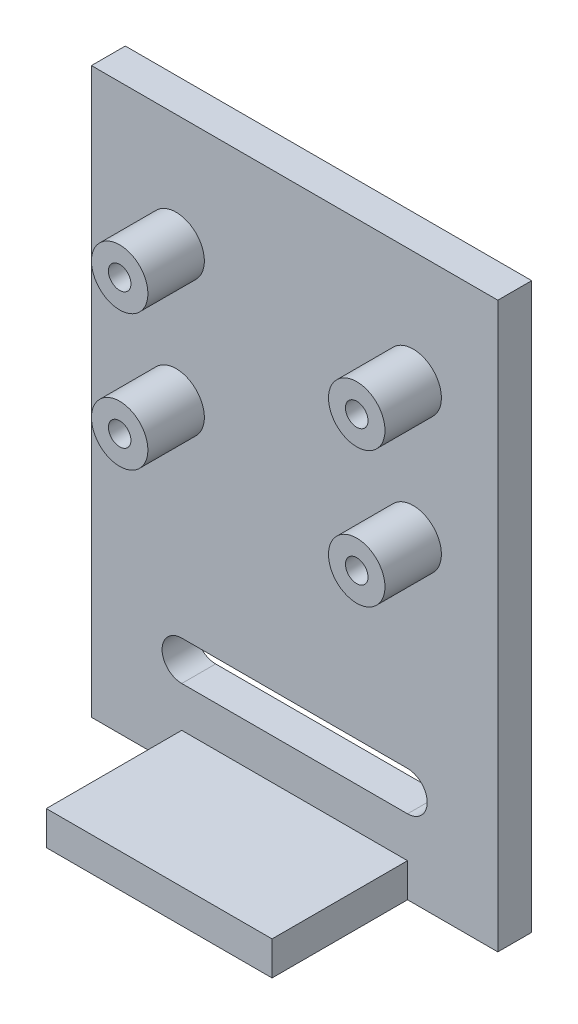
ISO-10303-21;
HEADER;
FILE_DESCRIPTION(('STEP AP214'),'2;1');
FILE_NAME('part.step','',(''),(''),'','','');
FILE_SCHEMA(('AUTOMOTIVE_DESIGN { 1 0 10303 214 1 1 1 1 }'));
ENDSEC;
DATA;
#1=APPLICATION_CONTEXT('core data for automotive mechanical design processes');
#2=APPLICATION_PROTOCOL_DEFINITION('international standard','automotive_design',2000,#1);
#3=PRODUCT_CONTEXT('',#1,'mechanical');
#4=PRODUCT('Part','Part','',(#3));
#5=PRODUCT_RELATED_PRODUCT_CATEGORY('part','',(#4));
#6=PRODUCT_DEFINITION_FORMATION('','',#4);
#7=PRODUCT_DEFINITION_CONTEXT('part definition',#1,'design');
#8=PRODUCT_DEFINITION('design','',#6,#7);
#9=PRODUCT_DEFINITION_SHAPE('','',#8);
#10=(LENGTH_UNIT() NAMED_UNIT(*) SI_UNIT(.MILLI.,.METRE.));
#11=(NAMED_UNIT(*) PLANE_ANGLE_UNIT() SI_UNIT($,.RADIAN.));
#12=(NAMED_UNIT(*) SI_UNIT($,.STERADIAN.) SOLID_ANGLE_UNIT());
#13=UNCERTAINTY_MEASURE_WITH_UNIT(LENGTH_MEASURE(1.E-05),#10,'distance_accuracy_value','');
#14=(GEOMETRIC_REPRESENTATION_CONTEXT(3) GLOBAL_UNCERTAINTY_ASSIGNED_CONTEXT((#13)) GLOBAL_UNIT_ASSIGNED_CONTEXT((#10,
#11,#12)) REPRESENTATION_CONTEXT('',''));
#15=CARTESIAN_POINT('',(0.,0.,0.));
#16=DIRECTION('',(0.,0.,1.));
#17=DIRECTION('',(1.,0.,0.));
#18=AXIS2_PLACEMENT_3D('',#15,#16,#17);
#19=CARTESIAN_POINT('',(0.,0.,3.));
#20=DIRECTION('',(0.,0.,-1.));
#21=DIRECTION('',(-1.,0.,0.));
#22=AXIS2_PLACEMENT_3D('',#19,#20,#21);
#23=PLANE('',#22);
#24=CARTESIAN_POINT('',(4.13294797687863,-2.05780346820808,3.));
#25=DIRECTION('',(0.,0.,-1.));
#26=DIRECTION('',(-1.,0.,0.));
#27=AXIS2_PLACEMENT_3D('',#24,#25,#26);
#28=CIRCLE('',#27,2.5);
#29=CARTESIAN_POINT('',(1.63294797687863,-2.05780346820808,3.));
#30=VERTEX_POINT('',#29);
#31=EDGE_CURVE('E11',#30,#30,#28,.F.);
#32=ORIENTED_EDGE('',*,*,#31,.F.);
#33=EDGE_LOOP('',(#32));
#34=FACE_BOUND('',#33,.T.);
#35=CARTESIAN_POINT('',(-16.8670520231214,-2.05780346820808,3.));
#36=DIRECTION('',(0.,0.,-1.));
#37=DIRECTION('',(-1.,0.,0.));
#38=AXIS2_PLACEMENT_3D('',#35,#36,#37);
#39=CIRCLE('',#38,2.5);
#40=CARTESIAN_POINT('',(-19.3670520231214,-2.05780346820808,3.));
#41=VERTEX_POINT('',#40);
#42=EDGE_CURVE('E42',#41,#41,#39,.F.);
#43=ORIENTED_EDGE('',*,*,#42,.F.);
#44=EDGE_LOOP('',(#43));
#45=FACE_BOUND('',#44,.T.);
#46=CARTESIAN_POINT('',(-16.8670520231214,9.94219653179192,3.));
#47=DIRECTION('',(0.,0.,-1.));
#48=DIRECTION('',(-1.,0.,0.));
#49=AXIS2_PLACEMENT_3D('',#46,#47,#48);
#50=CIRCLE('',#49,2.5);
#51=CARTESIAN_POINT('',(-19.3670520231214,9.94219653179192,3.));
#52=VERTEX_POINT('',#51);
#53=EDGE_CURVE('E221',#52,#52,#50,.F.);
#54=ORIENTED_EDGE('',*,*,#53,.F.);
#55=EDGE_LOOP('',(#54));
#56=FACE_BOUND('',#55,.T.);
#57=CARTESIAN_POINT('',(4.13294797687862,9.94219653179191,3.));
#58=DIRECTION('',(0.,0.,-1.));
#59=DIRECTION('',(-1.,0.,0.));
#60=AXIS2_PLACEMENT_3D('',#57,#58,#59);
#61=CIRCLE('',#60,2.5);
#62=CARTESIAN_POINT('',(1.63294797687862,9.94219653179191,3.));
#63=VERTEX_POINT('',#62);
#64=EDGE_CURVE('E218',#63,#63,#61,.F.);
#65=ORIENTED_EDGE('',*,*,#64,.F.);
#66=EDGE_LOOP('',(#65));
#67=FACE_BOUND('',#66,.T.);
#68=DIRECTION('',(1.,0.,0.));
#69=VECTOR('',#68,1.);
#70=CARTESIAN_POINT('',(-16.3670520231214,-23.4622845592564,3.));
#71=LINE('',#70,#69);
#72=CARTESIAN_POINT('',(-16.3670520231214,-23.4622845592564,3.));
#73=VERTEX_POINT('',#72);
#74=CARTESIAN_POINT('',(3.63294797687863,-23.4622845592564,3.));
#75=VERTEX_POINT('',#74);
#76=EDGE_CURVE('E135',#73,#75,#71,.T.);
#77=ORIENTED_EDGE('',*,*,#76,.F.);
#78=CARTESIAN_POINT('',(-16.3670520231214,-21.7213201317248,3.));
#79=DIRECTION('',(0.,0.,1.));
#80=DIRECTION('',(1.,0.,0.));
#81=AXIS2_PLACEMENT_3D('',#78,#79,#80);
#82=CIRCLE('',#81,1.74096442753159);
#83=CARTESIAN_POINT('',(-16.3670520231214,-19.9803557041932,3.));
#84=VERTEX_POINT('',#83);
#85=EDGE_CURVE('E49',#84,#73,#82,.T.);
#86=ORIENTED_EDGE('',*,*,#85,.F.);
#87=DIRECTION('',(-1.,0.,0.));
#88=VECTOR('',#87,1.);
#89=CARTESIAN_POINT('',(-16.3670520231214,-19.9803557041932,3.));
#90=LINE('',#89,#88);
#91=CARTESIAN_POINT('',(3.63294797687863,-19.9803557041932,3.));
#92=VERTEX_POINT('',#91);
#93=EDGE_CURVE('E141',#92,#84,#90,.T.);
#94=ORIENTED_EDGE('',*,*,#93,.F.);
#95=CARTESIAN_POINT('',(3.63294797687863,-21.7213201317248,3.));
#96=DIRECTION('',(0.,0.,1.));
#97=DIRECTION('',(1.,0.,0.));
#98=AXIS2_PLACEMENT_3D('',#95,#96,#97);
#99=CIRCLE('',#98,1.74096442753159);
#100=EDGE_CURVE('E126',#75,#92,#99,.T.);
#101=ORIENTED_EDGE('',*,*,#100,.F.);
#102=EDGE_LOOP('',(#77,#86,#94,#101));
#103=FACE_BOUND('',#102,.T.);
#104=DIRECTION('',(0.,-1.,0.));
#105=VECTOR('',#104,1.);
#106=CARTESIAN_POINT('',(-16.3670520231214,-27.0578034682081,3.));
#107=LINE('',#106,#105);
#108=CARTESIAN_POINT('',(-16.3670520231214,-27.0578034682081,3.));
#109=VERTEX_POINT('',#108);
#110=CARTESIAN_POINT('',(-16.3670520231214,-30.0578034682081,3.));
#111=VERTEX_POINT('',#110);
#112=EDGE_CURVE('E155',#109,#111,#107,.T.);
#113=ORIENTED_EDGE('',*,*,#112,.F.);
#114=DIRECTION('',(-1.,0.,0.));
#115=VECTOR('',#114,1.);
#116=CARTESIAN_POINT('',(3.63294797687862,-27.0578034682081,3.));
#117=LINE('',#116,#115);
#118=CARTESIAN_POINT('',(3.63294797687862,-27.0578034682081,3.));
#119=VERTEX_POINT('',#118);
#120=EDGE_CURVE('E164',#119,#109,#117,.T.);
#121=ORIENTED_EDGE('',*,*,#120,.F.);
#122=DIRECTION('',(0.,1.,0.));
#123=VECTOR('',#122,1.);
#124=CARTESIAN_POINT('',(3.63294797687862,-30.0578034682081,3.));
#125=LINE('',#124,#123);
#126=CARTESIAN_POINT('',(3.63294797687862,-30.0578034682081,3.));
#127=VERTEX_POINT('',#126);
#128=EDGE_CURVE('E148',#127,#119,#125,.T.);
#129=ORIENTED_EDGE('',*,*,#128,.F.);
#130=DIRECTION('',(1.,0.,0.));
#131=VECTOR('',#130,1.);
#132=CARTESIAN_POINT('',(11.6329479768786,-30.0578034682081,3.));
#133=LINE('',#132,#131);
#134=CARTESIAN_POINT('',(11.6329479768786,-30.0578034682081,3.));
#135=VERTEX_POINT('',#134);
#136=EDGE_CURVE('E189',#127,#135,#133,.T.);
#137=ORIENTED_EDGE('',*,*,#136,.T.);
#138=DIRECTION('',(0.,1.,0.));
#139=VECTOR('',#138,1.);
#140=CARTESIAN_POINT('',(11.6329479768786,19.9421965317919,3.));
#141=LINE('',#140,#139);
#142=CARTESIAN_POINT('',(11.6329479768786,19.9421965317919,3.));
#143=VERTEX_POINT('',#142);
#144=EDGE_CURVE('E181',#135,#143,#141,.T.);
#145=ORIENTED_EDGE('',*,*,#144,.T.);
#146=DIRECTION('',(-1.,0.,0.));
#147=VECTOR('',#146,1.);
#148=CARTESIAN_POINT('',(11.6329479768786,19.9421965317919,3.));
#149=LINE('',#148,#147);
#150=CARTESIAN_POINT('',(-24.3670520231214,19.9421965317919,3.));
#151=VERTEX_POINT('',#150);
#152=EDGE_CURVE('E184',#143,#151,#149,.T.);
#153=ORIENTED_EDGE('',*,*,#152,.T.);
#154=DIRECTION('',(0.,-1.,0.));
#155=VECTOR('',#154,1.);
#156=CARTESIAN_POINT('',(-24.3670520231214,19.9421965317919,3.));
#157=LINE('',#156,#155);
#158=CARTESIAN_POINT('',(-24.3670520231214,-30.0578034682081,3.));
#159=VERTEX_POINT('',#158);
#160=EDGE_CURVE('E187',#151,#159,#157,.T.);
#161=ORIENTED_EDGE('',*,*,#160,.T.);
#162=EDGE_CURVE('E190',#159,#111,#133,.T.);
#163=ORIENTED_EDGE('',*,*,#162,.T.);
#164=EDGE_LOOP('',(#113,#121,#129,#137,#145,#153,#161,#163));
#165=FACE_BOUND('',#164,.T.);
#166=ADVANCED_FACE('F34',(#34,#45,#56,#67,#103,#165),#23,.F.);
#167=CARTESIAN_POINT('',(11.6329479768786,19.9421965317919,3.));
#168=DIRECTION('',(-1.,0.,0.));
#169=DIRECTION('',(0.,0.,1.));
#170=AXIS2_PLACEMENT_3D('',#167,#168,#169);
#171=PLANE('',#170);
#172=DIRECTION('',(0.,1.,0.));
#173=VECTOR('',#172,1.);
#174=CARTESIAN_POINT('',(11.6329479768786,19.9421965317919,0.));
#175=LINE('',#174,#173);
#176=CARTESIAN_POINT('',(11.6329479768786,-30.0578034682081,0.));
#177=VERTEX_POINT('',#176);
#178=CARTESIAN_POINT('',(11.6329479768786,19.9421965317919,0.));
#179=VERTEX_POINT('',#178);
#180=EDGE_CURVE('E180',#177,#179,#175,.T.);
#181=ORIENTED_EDGE('',*,*,#180,.T.);
#182=DIRECTION('',(0.,0.,-1.));
#183=VECTOR('',#182,1.);
#184=CARTESIAN_POINT('',(11.6329479768786,19.9421965317919,3.));
#185=LINE('',#184,#183);
#186=EDGE_CURVE('E208',#143,#179,#185,.T.);
#187=ORIENTED_EDGE('',*,*,#186,.F.);
#188=ORIENTED_EDGE('',*,*,#144,.F.);
#189=DIRECTION('',(0.,0.,-1.));
#190=VECTOR('',#189,1.);
#191=CARTESIAN_POINT('',(11.6329479768786,-30.0578034682081,3.));
#192=LINE('',#191,#190);
#193=EDGE_CURVE('E192',#135,#177,#192,.T.);
#194=ORIENTED_EDGE('',*,*,#193,.T.);
#195=EDGE_LOOP('',(#181,#187,#188,#194));
#196=FACE_BOUND('',#195,.T.);
#197=ADVANCED_FACE('F36',(#196),#171,.F.);
#198=CARTESIAN_POINT('',(11.6329479768786,19.9421965317919,3.));
#199=DIRECTION('',(0.,-1.,0.));
#200=DIRECTION('',(0.,0.,-1.));
#201=AXIS2_PLACEMENT_3D('',#198,#199,#200);
#202=PLANE('',#201);
#203=DIRECTION('',(-1.,0.,0.));
#204=VECTOR('',#203,1.);
#205=CARTESIAN_POINT('',(11.6329479768786,19.9421965317919,0.));
#206=LINE('',#205,#204);
#207=CARTESIAN_POINT('',(-24.3670520231214,19.9421965317919,0.));
#208=VERTEX_POINT('',#207);
#209=EDGE_CURVE('E195',#179,#208,#206,.T.);
#210=ORIENTED_EDGE('',*,*,#209,.T.);
#211=DIRECTION('',(0.,0.,-1.));
#212=VECTOR('',#211,1.);
#213=CARTESIAN_POINT('',(-24.3670520231214,19.9421965317919,3.));
#214=LINE('',#213,#212);
#215=EDGE_CURVE('E205',#151,#208,#214,.T.);
#216=ORIENTED_EDGE('',*,*,#215,.F.);
#217=ORIENTED_EDGE('',*,*,#152,.F.);
#218=ORIENTED_EDGE('',*,*,#186,.T.);
#219=EDGE_LOOP('',(#210,#216,#217,#218));
#220=FACE_BOUND('',#219,.T.);
#221=ADVANCED_FACE('F291',(#220),#202,.F.);
#222=CARTESIAN_POINT('',(-24.3670520231214,19.9421965317919,3.));
#223=DIRECTION('',(1.,0.,0.));
#224=DIRECTION('',(0.,1.,0.));
#225=AXIS2_PLACEMENT_3D('',#222,#223,#224);
#226=PLANE('',#225);
#227=DIRECTION('',(0.,-1.,0.));
#228=VECTOR('',#227,1.);
#229=CARTESIAN_POINT('',(-24.3670520231214,19.9421965317919,0.));
#230=LINE('',#229,#228);
#231=CARTESIAN_POINT('',(-24.3670520231214,-30.0578034682081,0.));
#232=VERTEX_POINT('',#231);
#233=EDGE_CURVE('E197',#208,#232,#230,.T.);
#234=ORIENTED_EDGE('',*,*,#233,.T.);
#235=DIRECTION('',(0.,0.,-1.));
#236=VECTOR('',#235,1.);
#237=CARTESIAN_POINT('',(-24.3670520231214,-30.0578034682081,3.));
#238=LINE('',#237,#236);
#239=EDGE_CURVE('E202',#159,#232,#238,.T.);
#240=ORIENTED_EDGE('',*,*,#239,.F.);
#241=ORIENTED_EDGE('',*,*,#160,.F.);
#242=ORIENTED_EDGE('',*,*,#215,.T.);
#243=EDGE_LOOP('',(#234,#240,#241,#242));
#244=FACE_BOUND('',#243,.T.);
#245=ADVANCED_FACE('F288',(#244),#226,.F.);
#246=CARTESIAN_POINT('',(11.6329479768786,-30.0578034682081,3.));
#247=DIRECTION('',(0.,1.,0.));
#248=DIRECTION('',(-1.,0.,0.));
#249=AXIS2_PLACEMENT_3D('',#246,#247,#248);
#250=PLANE('',#249);
#251=DIRECTION('',(1.,0.,0.));
#252=VECTOR('',#251,1.);
#253=CARTESIAN_POINT('',(11.6329479768786,-30.0578034682081,0.));
#254=LINE('',#253,#252);
#255=EDGE_CURVE('E185',#232,#177,#254,.T.);
#256=ORIENTED_EDGE('',*,*,#255,.T.);
#257=ORIENTED_EDGE('',*,*,#193,.F.);
#258=ORIENTED_EDGE('',*,*,#136,.F.);
#259=DIRECTION('',(0.,0.,-1.));
#260=VECTOR('',#259,1.);
#261=CARTESIAN_POINT('',(3.63294797687862,-30.0578034682081,15.));
#262=LINE('',#261,#260);
#263=CARTESIAN_POINT('',(3.63294797687862,-30.0578034682081,15.));
#264=VERTEX_POINT('',#263);
#265=EDGE_CURVE('E177',#264,#127,#262,.T.);
#266=ORIENTED_EDGE('',*,*,#265,.F.);
#267=DIRECTION('',(1.,0.,0.));
#268=VECTOR('',#267,1.);
#269=CARTESIAN_POINT('',(-16.3670520231214,-30.0578034682081,15.));
#270=LINE('',#269,#268);
#271=CARTESIAN_POINT('',(-16.3670520231214,-30.0578034682081,15.));
#272=VERTEX_POINT('',#271);
#273=EDGE_CURVE('E151',#272,#264,#270,.T.);
#274=ORIENTED_EDGE('',*,*,#273,.F.);
#275=DIRECTION('',(0.,0.,-1.));
#276=VECTOR('',#275,1.);
#277=CARTESIAN_POINT('',(-16.3670520231214,-30.0578034682081,15.));
#278=LINE('',#277,#276);
#279=EDGE_CURVE('E161',#272,#111,#278,.T.);
#280=ORIENTED_EDGE('',*,*,#279,.T.);
#281=ORIENTED_EDGE('',*,*,#162,.F.);
#282=ORIENTED_EDGE('',*,*,#239,.T.);
#283=EDGE_LOOP('',(#256,#257,#258,#266,#274,#280,#281,#282));
#284=FACE_BOUND('',#283,.T.);
#285=ADVANCED_FACE('F284',(#284),#250,.F.);
#286=CARTESIAN_POINT('',(0.,0.,0.));
#287=DIRECTION('',(0.,0.,-1.));
#288=DIRECTION('',(-1.,0.,0.));
#289=AXIS2_PLACEMENT_3D('',#286,#287,#288);
#290=PLANE('',#289);
#291=CARTESIAN_POINT('',(-16.3670520231214,-21.7213201317248,0.));
#292=DIRECTION('',(0.,0.,-1.));
#293=DIRECTION('',(-1.,0.,0.));
#294=AXIS2_PLACEMENT_3D('',#291,#292,#293);
#295=CIRCLE('',#294,1.74096442753159);
#296=CARTESIAN_POINT('',(-16.3670520231214,-23.4622845592564,0.));
#297=VERTEX_POINT('',#296);
#298=CARTESIAN_POINT('',(-16.3670520231214,-19.9803557041932,0.));
#299=VERTEX_POINT('',#298);
#300=EDGE_CURVE('E216',#297,#299,#295,.T.);
#301=ORIENTED_EDGE('',*,*,#300,.F.);
#302=DIRECTION('',(-1.,0.,0.));
#303=VECTOR('',#302,1.);
#304=CARTESIAN_POINT('',(0.,-23.4622845592564,0.));
#305=LINE('',#304,#303);
#306=CARTESIAN_POINT('',(3.63294797687863,-23.4622845592564,0.));
#307=VERTEX_POINT('',#306);
#308=EDGE_CURVE('E211',#307,#297,#305,.T.);
#309=ORIENTED_EDGE('',*,*,#308,.F.);
#310=CARTESIAN_POINT('',(3.63294797687863,-21.7213201317248,0.));
#311=DIRECTION('',(0.,0.,-1.));
#312=DIRECTION('',(-1.,0.,0.));
#313=AXIS2_PLACEMENT_3D('',#310,#311,#312);
#314=CIRCLE('',#313,1.74096442753159);
#315=CARTESIAN_POINT('',(3.63294797687863,-19.9803557041932,0.));
#316=VERTEX_POINT('',#315);
#317=EDGE_CURVE('E129',#316,#307,#314,.T.);
#318=ORIENTED_EDGE('',*,*,#317,.F.);
#319=DIRECTION('',(1.,0.,0.));
#320=VECTOR('',#319,1.);
#321=CARTESIAN_POINT('',(0.,-19.9803557041932,0.));
#322=LINE('',#321,#320);
#323=EDGE_CURVE('E214',#299,#316,#322,.T.);
#324=ORIENTED_EDGE('',*,*,#323,.F.);
#325=EDGE_LOOP('',(#301,#309,#318,#324));
#326=FACE_BOUND('',#325,.T.);
#327=ORIENTED_EDGE('',*,*,#180,.F.);
#328=ORIENTED_EDGE('',*,*,#255,.F.);
#329=ORIENTED_EDGE('',*,*,#233,.F.);
#330=ORIENTED_EDGE('',*,*,#209,.F.);
#331=EDGE_LOOP('',(#327,#328,#329,#330));
#332=FACE_BOUND('',#331,.T.);
#333=ADVANCED_FACE('F279',(#326,#332),#290,.T.);
#334=CARTESIAN_POINT('',(3.63294797687862,-30.0578034682081,15.));
#335=DIRECTION('',(-1.,0.,0.));
#336=DIRECTION('',(0.,0.,1.));
#337=AXIS2_PLACEMENT_3D('',#334,#335,#336);
#338=PLANE('',#337);
#339=ORIENTED_EDGE('',*,*,#128,.T.);
#340=DIRECTION('',(0.,0.,-1.));
#341=VECTOR('',#340,1.);
#342=CARTESIAN_POINT('',(3.63294797687862,-27.0578034682081,15.));
#343=LINE('',#342,#341);
#344=CARTESIAN_POINT('',(3.63294797687862,-27.0578034682081,15.));
#345=VERTEX_POINT('',#344);
#346=EDGE_CURVE('E174',#345,#119,#343,.T.);
#347=ORIENTED_EDGE('',*,*,#346,.F.);
#348=DIRECTION('',(0.,1.,0.));
#349=VECTOR('',#348,1.);
#350=CARTESIAN_POINT('',(3.63294797687862,-30.0578034682081,15.));
#351=LINE('',#350,#349);
#352=EDGE_CURVE('E154',#264,#345,#351,.T.);
#353=ORIENTED_EDGE('',*,*,#352,.F.);
#354=ORIENTED_EDGE('',*,*,#265,.T.);
#355=EDGE_LOOP('',(#339,#347,#353,#354));
#356=FACE_BOUND('',#355,.T.);
#357=ADVANCED_FACE('F276',(#356),#338,.F.);
#358=CARTESIAN_POINT('',(3.63294797687862,-27.0578034682081,15.));
#359=DIRECTION('',(0.,-1.,0.));
#360=DIRECTION('',(1.,0.,0.));
#361=AXIS2_PLACEMENT_3D('',#358,#359,#360);
#362=PLANE('',#361);
#363=ORIENTED_EDGE('',*,*,#120,.T.);
#364=DIRECTION('',(0.,0.,-1.));
#365=VECTOR('',#364,1.);
#366=CARTESIAN_POINT('',(-16.3670520231214,-27.0578034682081,15.));
#367=LINE('',#366,#365);
#368=CARTESIAN_POINT('',(-16.3670520231214,-27.0578034682081,15.));
#369=VERTEX_POINT('',#368);
#370=EDGE_CURVE('E171',#369,#109,#367,.T.);
#371=ORIENTED_EDGE('',*,*,#370,.F.);
#372=DIRECTION('',(-1.,0.,0.));
#373=VECTOR('',#372,1.);
#374=CARTESIAN_POINT('',(3.63294797687862,-27.0578034682081,15.));
#375=LINE('',#374,#373);
#376=EDGE_CURVE('E157',#345,#369,#375,.T.);
#377=ORIENTED_EDGE('',*,*,#376,.F.);
#378=ORIENTED_EDGE('',*,*,#346,.T.);
#379=EDGE_LOOP('',(#363,#371,#377,#378));
#380=FACE_BOUND('',#379,.T.);
#381=ADVANCED_FACE('F272',(#380),#362,.F.);
#382=CARTESIAN_POINT('',(-16.3670520231214,-27.0578034682081,15.));
#383=DIRECTION('',(1.,0.,0.));
#384=DIRECTION('',(0.,0.,-1.));
#385=AXIS2_PLACEMENT_3D('',#382,#383,#384);
#386=PLANE('',#385);
#387=ORIENTED_EDGE('',*,*,#112,.T.);
#388=ORIENTED_EDGE('',*,*,#279,.F.);
#389=DIRECTION('',(0.,-1.,0.));
#390=VECTOR('',#389,1.);
#391=CARTESIAN_POINT('',(-16.3670520231214,-27.0578034682081,15.));
#392=LINE('',#391,#390);
#393=EDGE_CURVE('E159',#369,#272,#392,.T.);
#394=ORIENTED_EDGE('',*,*,#393,.F.);
#395=ORIENTED_EDGE('',*,*,#370,.T.);
#396=EDGE_LOOP('',(#387,#388,#394,#395));
#397=FACE_BOUND('',#396,.T.);
#398=ADVANCED_FACE('F268',(#397),#386,.F.);
#399=CARTESIAN_POINT('',(0.,0.,15.));
#400=DIRECTION('',(0.,0.,1.));
#401=DIRECTION('',(1.,0.,0.));
#402=AXIS2_PLACEMENT_3D('',#399,#400,#401);
#403=PLANE('',#402);
#404=ORIENTED_EDGE('',*,*,#273,.T.);
#405=ORIENTED_EDGE('',*,*,#352,.T.);
#406=ORIENTED_EDGE('',*,*,#376,.T.);
#407=ORIENTED_EDGE('',*,*,#393,.T.);
#408=EDGE_LOOP('',(#404,#405,#406,#407));
#409=FACE_BOUND('',#408,.T.);
#410=ADVANCED_FACE('F265',(#409),#403,.T.);
#411=CARTESIAN_POINT('',(-16.3670520231214,-21.7213201317248,-2.));
#412=DIRECTION('',(0.,0.,1.));
#413=DIRECTION('',(1.,0.,0.));
#414=AXIS2_PLACEMENT_3D('',#411,#412,#413);
#415=CYLINDRICAL_SURFACE('',#414,1.74096442753159);
#416=ORIENTED_EDGE('',*,*,#300,.T.);
#417=DIRECTION('',(0.,0.,1.));
#418=VECTOR('',#417,1.);
#419=CARTESIAN_POINT('',(-16.3670520231214,-19.9803557041932,-2.));
#420=LINE('',#419,#418);
#421=EDGE_CURVE('E146',#299,#84,#420,.T.);
#422=ORIENTED_EDGE('',*,*,#421,.T.);
#423=ORIENTED_EDGE('',*,*,#85,.T.);
#424=DIRECTION('',(0.,0.,1.));
#425=VECTOR('',#424,1.);
#426=CARTESIAN_POINT('',(-16.3670520231214,-23.4622845592564,-2.));
#427=LINE('',#426,#425);
#428=EDGE_CURVE('E132',#297,#73,#427,.T.);
#429=ORIENTED_EDGE('',*,*,#428,.F.);
#430=EDGE_LOOP('',(#416,#422,#423,#429));
#431=FACE_BOUND('',#430,.T.);
#432=ADVANCED_FACE('F257',(#431),#415,.F.);
#433=CARTESIAN_POINT('',(-16.3670520231214,-19.9803557041932,-2.));
#434=DIRECTION('',(0.,1.,0.));
#435=DIRECTION('',(0.,0.,1.));
#436=AXIS2_PLACEMENT_3D('',#433,#434,#435);
#437=PLANE('',#436);
#438=ORIENTED_EDGE('',*,*,#323,.T.);
#439=DIRECTION('',(0.,0.,1.));
#440=VECTOR('',#439,1.);
#441=CARTESIAN_POINT('',(3.63294797687863,-19.9803557041932,-2.));
#442=LINE('',#441,#440);
#443=EDGE_CURVE('E131',#316,#92,#442,.T.);
#444=ORIENTED_EDGE('',*,*,#443,.T.);
#445=ORIENTED_EDGE('',*,*,#93,.T.);
#446=ORIENTED_EDGE('',*,*,#421,.F.);
#447=EDGE_LOOP('',(#438,#444,#445,#446));
#448=FACE_BOUND('',#447,.T.);
#449=ADVANCED_FACE('F254',(#448),#437,.F.);
#450=CARTESIAN_POINT('',(3.63294797687863,-21.7213201317248,-2.));
#451=DIRECTION('',(0.,0.,1.));
#452=DIRECTION('',(1.,0.,0.));
#453=AXIS2_PLACEMENT_3D('',#450,#451,#452);
#454=CYLINDRICAL_SURFACE('',#453,1.74096442753159);
#455=ORIENTED_EDGE('',*,*,#317,.T.);
#456=DIRECTION('',(0.,0.,1.));
#457=VECTOR('',#456,1.);
#458=CARTESIAN_POINT('',(3.63294797687863,-23.4622845592564,-2.));
#459=LINE('',#458,#457);
#460=EDGE_CURVE('E57',#307,#75,#459,.T.);
#461=ORIENTED_EDGE('',*,*,#460,.T.);
#462=ORIENTED_EDGE('',*,*,#100,.T.);
#463=ORIENTED_EDGE('',*,*,#443,.F.);
#464=EDGE_LOOP('',(#455,#461,#462,#463));
#465=FACE_BOUND('',#464,.T.);
#466=ADVANCED_FACE('F123',(#465),#454,.F.);
#467=CARTESIAN_POINT('',(-16.3670520231214,-23.4622845592564,-2.));
#468=DIRECTION('',(0.,-1.,0.));
#469=DIRECTION('',(0.,0.,-1.));
#470=AXIS2_PLACEMENT_3D('',#467,#468,#469);
#471=PLANE('',#470);
#472=ORIENTED_EDGE('',*,*,#308,.T.);
#473=ORIENTED_EDGE('',*,*,#428,.T.);
#474=ORIENTED_EDGE('',*,*,#76,.T.);
#475=ORIENTED_EDGE('',*,*,#460,.F.);
#476=EDGE_LOOP('',(#472,#473,#474,#475));
#477=FACE_BOUND('',#476,.T.);
#478=ADVANCED_FACE('F136',(#477),#471,.F.);
#479=CARTESIAN_POINT('',(4.13294797687862,9.94219653179191,8.));
#480=DIRECTION('',(0.,0.,1.));
#481=DIRECTION('',(1.,0.,0.));
#482=AXIS2_PLACEMENT_3D('',#479,#480,#481);
#483=PLANE('',#482);
#484=CARTESIAN_POINT('',(4.13294797687862,9.94219653179191,8.));
#485=DIRECTION('',(0.,0.,1.));
#486=DIRECTION('',(1.,0.,0.));
#487=AXIS2_PLACEMENT_3D('',#484,#485,#486);
#488=CIRCLE('',#487,2.5);
#489=CARTESIAN_POINT('',(6.63294797687862,9.94219653179191,8.));
#490=VERTEX_POINT('',#489);
#491=EDGE_CURVE('E507',#490,#490,#488,.T.);
#492=ORIENTED_EDGE('',*,*,#491,.T.);
#493=EDGE_LOOP('',(#492));
#494=FACE_BOUND('',#493,.T.);
#495=CARTESIAN_POINT('',(4.13294797687862,9.94219653179191,8.));
#496=DIRECTION('',(0.,0.,1.));
#497=DIRECTION('',(1.,0.,0.));
#498=AXIS2_PLACEMENT_3D('',#495,#496,#497);
#499=CIRCLE('',#498,1.);
#500=CARTESIAN_POINT('',(5.13294797687862,9.94219653179191,8.));
#501=VERTEX_POINT('',#500);
#502=EDGE_CURVE('E504',#501,#501,#499,.T.);
#503=ORIENTED_EDGE('',*,*,#502,.F.);
#504=EDGE_LOOP('',(#503));
#505=FACE_BOUND('',#504,.T.);
#506=ADVANCED_FACE('F241',(#494,#505),#483,.T.);
#507=CARTESIAN_POINT('',(4.13294797687862,9.94219653179191,8.));
#508=DIRECTION('',(0.,0.,-1.));
#509=DIRECTION('',(-1.,0.,0.));
#510=AXIS2_PLACEMENT_3D('',#507,#508,#509);
#511=CYLINDRICAL_SURFACE('',#510,2.5);
#512=ORIENTED_EDGE('',*,*,#491,.F.);
#513=EDGE_LOOP('',(#512));
#514=FACE_BOUND('',#513,.T.);
#515=ORIENTED_EDGE('',*,*,#64,.T.);
#516=EDGE_LOOP('',(#515));
#517=FACE_BOUND('',#516,.T.);
#518=ADVANCED_FACE('F238',(#514,#517),#511,.T.);
#519=CARTESIAN_POINT('',(4.13294797687862,9.94219653179191,8.));
#520=DIRECTION('',(0.,0.,-1.));
#521=DIRECTION('',(-1.,0.,0.));
#522=AXIS2_PLACEMENT_3D('',#519,#520,#521);
#523=CYLINDRICAL_SURFACE('',#522,1.);
#524=ORIENTED_EDGE('',*,*,#502,.T.);
#525=EDGE_LOOP('',(#524));
#526=FACE_BOUND('',#525,.T.);
#527=CARTESIAN_POINT('',(4.13294797687862,9.94219653179191,3.));
#528=DIRECTION('',(0.,0.,1.));
#529=DIRECTION('',(1.,0.,0.));
#530=AXIS2_PLACEMENT_3D('',#527,#528,#529);
#531=CIRCLE('',#530,1.);
#532=CARTESIAN_POINT('',(5.13294797687862,9.94219653179191,3.));
#533=VERTEX_POINT('',#532);
#534=EDGE_CURVE('E503',#533,#533,#531,.T.);
#535=ORIENTED_EDGE('',*,*,#534,.F.);
#536=EDGE_LOOP('',(#535));
#537=FACE_BOUND('',#536,.T.);
#538=ADVANCED_FACE('F240',(#526,#537),#523,.F.);
#539=ORIENTED_EDGE('',*,*,#534,.T.);
#540=EDGE_LOOP('',(#539));
#541=FACE_BOUND('',#540,.T.);
#542=ADVANCED_FACE('F233',(#541),#23,.F.);
#543=CARTESIAN_POINT('',(-16.8670520231214,9.94219653179192,8.));
#544=DIRECTION('',(0.,0.,1.));
#545=DIRECTION('',(1.,0.,0.));
#546=AXIS2_PLACEMENT_3D('',#543,#544,#545);
#547=PLANE('',#546);
#548=CARTESIAN_POINT('',(-16.8670520231214,9.94219653179192,8.));
#549=DIRECTION('',(0.,0.,1.));
#550=DIRECTION('',(1.,0.,0.));
#551=AXIS2_PLACEMENT_3D('',#548,#549,#550);
#552=CIRCLE('',#551,2.5);
#553=CARTESIAN_POINT('',(-14.3670520231214,9.94219653179192,8.));
#554=VERTEX_POINT('',#553);
#555=EDGE_CURVE('E498',#554,#554,#552,.T.);
#556=ORIENTED_EDGE('',*,*,#555,.T.);
#557=EDGE_LOOP('',(#556));
#558=FACE_BOUND('',#557,.T.);
#559=CARTESIAN_POINT('',(-16.8670520231214,9.94219653179192,8.));
#560=DIRECTION('',(0.,0.,1.));
#561=DIRECTION('',(1.,0.,0.));
#562=AXIS2_PLACEMENT_3D('',#559,#560,#561);
#563=CIRCLE('',#562,1.);
#564=CARTESIAN_POINT('',(-15.8670520231214,9.94219653179192,8.));
#565=VERTEX_POINT('',#564);
#566=EDGE_CURVE('E495',#565,#565,#563,.T.);
#567=ORIENTED_EDGE('',*,*,#566,.F.);
#568=EDGE_LOOP('',(#567));
#569=FACE_BOUND('',#568,.T.);
#570=ADVANCED_FACE('F357',(#558,#569),#547,.T.);
#571=CARTESIAN_POINT('',(-16.8670520231214,9.94219653179192,8.));
#572=DIRECTION('',(0.,0.,-1.));
#573=DIRECTION('',(-1.,0.,0.));
#574=AXIS2_PLACEMENT_3D('',#571,#572,#573);
#575=CYLINDRICAL_SURFACE('',#574,2.5);
#576=ORIENTED_EDGE('',*,*,#555,.F.);
#577=EDGE_LOOP('',(#576));
#578=FACE_BOUND('',#577,.T.);
#579=ORIENTED_EDGE('',*,*,#53,.T.);
#580=EDGE_LOOP('',(#579));
#581=FACE_BOUND('',#580,.T.);
#582=ADVANCED_FACE('F367',(#578,#581),#575,.T.);
#583=CARTESIAN_POINT('',(-16.8670520231214,9.94219653179192,8.));
#584=DIRECTION('',(0.,0.,-1.));
#585=DIRECTION('',(-1.,0.,0.));
#586=AXIS2_PLACEMENT_3D('',#583,#584,#585);
#587=CYLINDRICAL_SURFACE('',#586,1.);
#588=ORIENTED_EDGE('',*,*,#566,.T.);
#589=EDGE_LOOP('',(#588));
#590=FACE_BOUND('',#589,.T.);
#591=CARTESIAN_POINT('',(-16.8670520231214,9.94219653179192,3.));
#592=DIRECTION('',(0.,0.,1.));
#593=DIRECTION('',(1.,0.,0.));
#594=AXIS2_PLACEMENT_3D('',#591,#592,#593);
#595=CIRCLE('',#594,1.);
#596=CARTESIAN_POINT('',(-15.8670520231214,9.94219653179192,3.));
#597=VERTEX_POINT('',#596);
#598=EDGE_CURVE('E494',#597,#597,#595,.T.);
#599=ORIENTED_EDGE('',*,*,#598,.F.);
#600=EDGE_LOOP('',(#599));
#601=FACE_BOUND('',#600,.T.);
#602=ADVANCED_FACE('F377',(#590,#601),#587,.F.);
#603=ORIENTED_EDGE('',*,*,#598,.T.);
#604=EDGE_LOOP('',(#603));
#605=FACE_BOUND('',#604,.T.);
#606=ADVANCED_FACE('F359',(#605),#23,.F.);
#607=CARTESIAN_POINT('',(-16.8670520231214,-2.05780346820808,8.));
#608=DIRECTION('',(0.,0.,1.));
#609=DIRECTION('',(1.,0.,0.));
#610=AXIS2_PLACEMENT_3D('',#607,#608,#609);
#611=PLANE('',#610);
#612=CARTESIAN_POINT('',(-16.8670520231214,-2.05780346820808,8.));
#613=DIRECTION('',(0.,0.,1.));
#614=DIRECTION('',(1.,0.,0.));
#615=AXIS2_PLACEMENT_3D('',#612,#613,#614);
#616=CIRCLE('',#615,2.5);
#617=CARTESIAN_POINT('',(-14.3670520231214,-2.05780346820808,8.));
#618=VERTEX_POINT('',#617);
#619=EDGE_CURVE('E489',#618,#618,#616,.T.);
#620=ORIENTED_EDGE('',*,*,#619,.T.);
#621=EDGE_LOOP('',(#620));
#622=FACE_BOUND('',#621,.T.);
#623=CARTESIAN_POINT('',(-16.8670520231214,-2.05780346820808,8.));
#624=DIRECTION('',(0.,0.,1.));
#625=DIRECTION('',(1.,0.,0.));
#626=AXIS2_PLACEMENT_3D('',#623,#624,#625);
#627=CIRCLE('',#626,1.);
#628=CARTESIAN_POINT('',(-15.8670520231214,-2.05780346820808,8.));
#629=VERTEX_POINT('',#628);
#630=EDGE_CURVE('E486',#629,#629,#627,.T.);
#631=ORIENTED_EDGE('',*,*,#630,.F.);
#632=EDGE_LOOP('',(#631));
#633=FACE_BOUND('',#632,.T.);
#634=ADVANCED_FACE('F396',(#622,#633),#611,.T.);
#635=CARTESIAN_POINT('',(-16.8670520231214,-2.05780346820808,8.));
#636=DIRECTION('',(0.,0.,-1.));
#637=DIRECTION('',(-1.,0.,0.));
#638=AXIS2_PLACEMENT_3D('',#635,#636,#637);
#639=CYLINDRICAL_SURFACE('',#638,2.5);
#640=ORIENTED_EDGE('',*,*,#619,.F.);
#641=EDGE_LOOP('',(#640));
#642=FACE_BOUND('',#641,.T.);
#643=ORIENTED_EDGE('',*,*,#42,.T.);
#644=EDGE_LOOP('',(#643));
#645=FACE_BOUND('',#644,.T.);
#646=ADVANCED_FACE('F226',(#642,#645),#639,.T.);
#647=CARTESIAN_POINT('',(-16.8670520231214,-2.05780346820808,8.));
#648=DIRECTION('',(0.,0.,-1.));
#649=DIRECTION('',(-1.,0.,0.));
#650=AXIS2_PLACEMENT_3D('',#647,#648,#649);
#651=CYLINDRICAL_SURFACE('',#650,1.);
#652=ORIENTED_EDGE('',*,*,#630,.T.);
#653=EDGE_LOOP('',(#652));
#654=FACE_BOUND('',#653,.T.);
#655=CARTESIAN_POINT('',(-16.8670520231214,-2.05780346820808,3.));
#656=DIRECTION('',(0.,0.,1.));
#657=DIRECTION('',(1.,0.,0.));
#658=AXIS2_PLACEMENT_3D('',#655,#656,#657);
#659=CIRCLE('',#658,1.);
#660=CARTESIAN_POINT('',(-15.8670520231214,-2.05780346820808,3.));
#661=VERTEX_POINT('',#660);
#662=EDGE_CURVE('E485',#661,#661,#659,.T.);
#663=ORIENTED_EDGE('',*,*,#662,.F.);
#664=EDGE_LOOP('',(#663));
#665=FACE_BOUND('',#664,.T.);
#666=ADVANCED_FACE('F415',(#654,#665),#651,.F.);
#667=ORIENTED_EDGE('',*,*,#662,.T.);
#668=EDGE_LOOP('',(#667));
#669=FACE_BOUND('',#668,.T.);
#670=ADVANCED_FACE('F398',(#669),#23,.F.);
#671=CARTESIAN_POINT('',(4.13294797687863,-2.05780346820808,8.));
#672=DIRECTION('',(0.,0.,1.));
#673=DIRECTION('',(1.,0.,0.));
#674=AXIS2_PLACEMENT_3D('',#671,#672,#673);
#675=PLANE('',#674);
#676=CARTESIAN_POINT('',(4.13294797687863,-2.05780346820808,8.));
#677=DIRECTION('',(0.,0.,1.));
#678=DIRECTION('',(1.,0.,0.));
#679=AXIS2_PLACEMENT_3D('',#676,#677,#678);
#680=CIRCLE('',#679,2.5);
#681=CARTESIAN_POINT('',(6.63294797687863,-2.05780346820808,8.));
#682=VERTEX_POINT('',#681);
#683=EDGE_CURVE('E480',#682,#682,#680,.T.);
#684=ORIENTED_EDGE('',*,*,#683,.T.);
#685=EDGE_LOOP('',(#684));
#686=FACE_BOUND('',#685,.T.);
#687=CARTESIAN_POINT('',(4.13294797687863,-2.05780346820808,8.));
#688=DIRECTION('',(0.,0.,1.));
#689=DIRECTION('',(1.,0.,0.));
#690=AXIS2_PLACEMENT_3D('',#687,#688,#689);
#691=CIRCLE('',#690,1.);
#692=CARTESIAN_POINT('',(5.13294797687863,-2.05780346820808,8.));
#693=VERTEX_POINT('',#692);
#694=EDGE_CURVE('E477',#693,#693,#691,.T.);
#695=ORIENTED_EDGE('',*,*,#694,.F.);
#696=EDGE_LOOP('',(#695));
#697=FACE_BOUND('',#696,.T.);
#698=ADVANCED_FACE('F434',(#686,#697),#675,.T.);
#699=CARTESIAN_POINT('',(4.13294797687863,-2.05780346820808,8.));
#700=DIRECTION('',(0.,0.,-1.));
#701=DIRECTION('',(-1.,0.,0.));
#702=AXIS2_PLACEMENT_3D('',#699,#700,#701);
#703=CYLINDRICAL_SURFACE('',#702,2.5);
#704=ORIENTED_EDGE('',*,*,#683,.F.);
#705=EDGE_LOOP('',(#704));
#706=FACE_BOUND('',#705,.T.);
#707=ORIENTED_EDGE('',*,*,#31,.T.);
#708=EDGE_LOOP('',(#707));
#709=FACE_BOUND('',#708,.T.);
#710=ADVANCED_FACE('F442',(#706,#709),#703,.T.);
#711=CARTESIAN_POINT('',(4.13294797687863,-2.05780346820808,8.));
#712=DIRECTION('',(0.,0.,-1.));
#713=DIRECTION('',(-1.,0.,0.));
#714=AXIS2_PLACEMENT_3D('',#711,#712,#713);
#715=CYLINDRICAL_SURFACE('',#714,1.);
#716=ORIENTED_EDGE('',*,*,#694,.T.);
#717=EDGE_LOOP('',(#716));
#718=FACE_BOUND('',#717,.T.);
#719=CARTESIAN_POINT('',(4.13294797687863,-2.05780346820808,3.));
#720=DIRECTION('',(0.,0.,1.));
#721=DIRECTION('',(1.,0.,0.));
#722=AXIS2_PLACEMENT_3D('',#719,#720,#721);
#723=CIRCLE('',#722,1.);
#724=CARTESIAN_POINT('',(5.13294797687863,-2.05780346820808,3.));
#725=VERTEX_POINT('',#724);
#726=EDGE_CURVE('E475',#725,#725,#723,.T.);
#727=ORIENTED_EDGE('',*,*,#726,.F.);
#728=EDGE_LOOP('',(#727));
#729=FACE_BOUND('',#728,.T.);
#730=ADVANCED_FACE('F452',(#718,#729),#715,.F.);
#731=ORIENTED_EDGE('',*,*,#726,.T.);
#732=EDGE_LOOP('',(#731));
#733=FACE_BOUND('',#732,.T.);
#734=ADVANCED_FACE('F232',(#733),#23,.F.);
#735=CLOSED_SHELL('',(#166,#197,#221,#245,#285,#333,#357,#381,#398,#410,#432,#449,#466,#478,
#506,#518,#538,#542,#570,#582,#602,#606,#634,#646,#666,#670,#698,#710,#730,#734));
#736=MANIFOLD_SOLID_BREP('B2',#735);
#737=ADVANCED_BREP_SHAPE_REPRESENTATION('',(#18,#736),#14);
#738=SHAPE_DEFINITION_REPRESENTATION(#9,#737);
ENDSEC;
END-ISO-10303-21;
